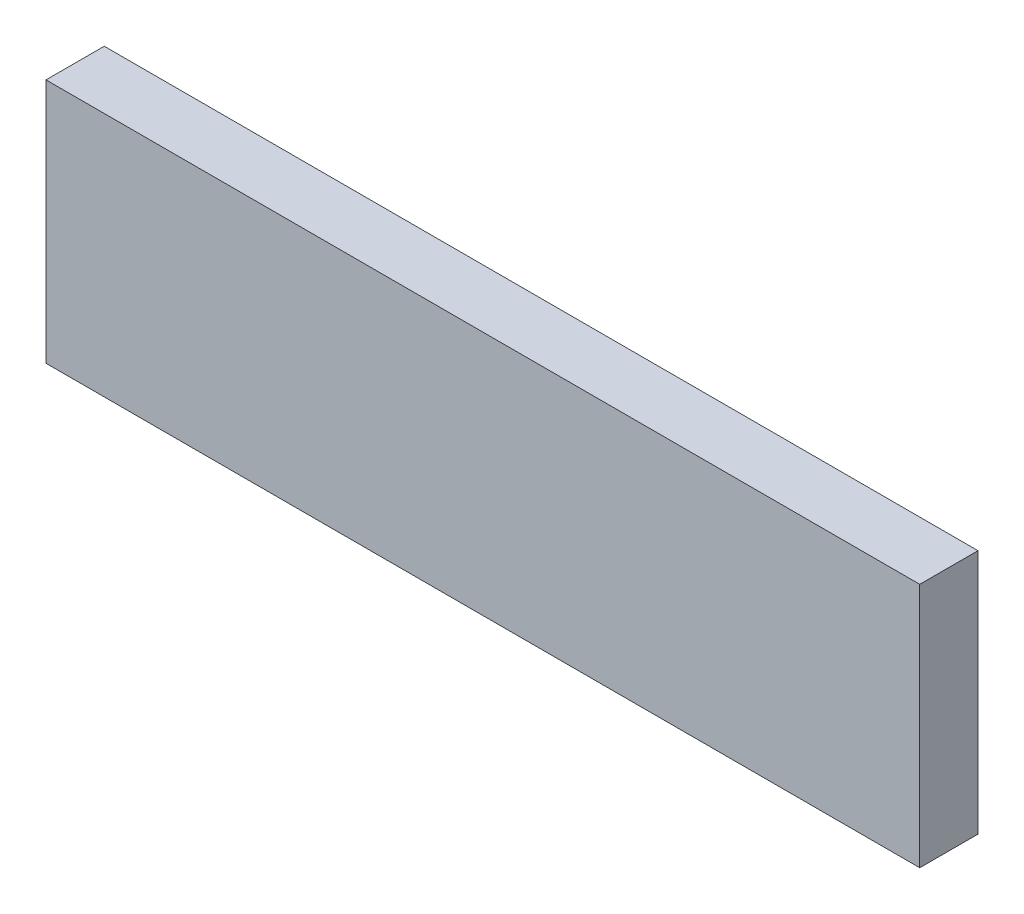
ISO-10303-21;
HEADER;
FILE_DESCRIPTION(('STEP AP214'),'2;1');
FILE_NAME('part.step','',(''),(''),'','','');
FILE_SCHEMA(('AUTOMOTIVE_DESIGN { 1 0 10303 214 1 1 1 1 }'));
ENDSEC;
DATA;
#1=APPLICATION_CONTEXT('core data for automotive mechanical design processes');
#2=APPLICATION_PROTOCOL_DEFINITION('international standard','automotive_design',2000,#1);
#3=PRODUCT_CONTEXT('',#1,'mechanical');
#4=PRODUCT('Part','Part','',(#3));
#5=PRODUCT_RELATED_PRODUCT_CATEGORY('part','',(#4));
#6=PRODUCT_DEFINITION_FORMATION('','',#4);
#7=PRODUCT_DEFINITION_CONTEXT('part definition',#1,'design');
#8=PRODUCT_DEFINITION('design','',#6,#7);
#9=PRODUCT_DEFINITION_SHAPE('','',#8);
#10=(LENGTH_UNIT() NAMED_UNIT(*) SI_UNIT(.MILLI.,.METRE.));
#11=(NAMED_UNIT(*) PLANE_ANGLE_UNIT() SI_UNIT($,.RADIAN.));
#12=(NAMED_UNIT(*) SI_UNIT($,.STERADIAN.) SOLID_ANGLE_UNIT());
#13=UNCERTAINTY_MEASURE_WITH_UNIT(LENGTH_MEASURE(1.E-05),#10,'distance_accuracy_value','');
#14=(GEOMETRIC_REPRESENTATION_CONTEXT(3) GLOBAL_UNCERTAINTY_ASSIGNED_CONTEXT((#13)) GLOBAL_UNIT_ASSIGNED_CONTEXT((#10,
#11,#12)) REPRESENTATION_CONTEXT('',''));
#15=CARTESIAN_POINT('',(0.,0.,0.));
#16=DIRECTION('',(0.,0.,1.));
#17=DIRECTION('',(1.,0.,0.));
#18=AXIS2_PLACEMENT_3D('',#15,#16,#17);
#19=CARTESIAN_POINT('',(0.,0.,7.));
#20=DIRECTION('',(1.,0.,0.));
#21=DIRECTION('',(0.,0.,-1.));
#22=AXIS2_PLACEMENT_3D('',#19,#20,#21);
#23=PLANE('',#22);
#24=DIRECTION('',(0.,-1.,0.));
#25=VECTOR('',#24,1.);
#26=CARTESIAN_POINT('',(0.,0.,0.));
#27=LINE('',#26,#25);
#28=CARTESIAN_POINT('',(0.,0.,0.));
#29=VERTEX_POINT('',#28);
#30=CARTESIAN_POINT('',(0.,-29.5,0.));
#31=VERTEX_POINT('',#30);
#32=EDGE_CURVE('E109',#29,#31,#27,.T.);
#33=ORIENTED_EDGE('',*,*,#32,.T.);
#34=DIRECTION('',(0.,0.,-1.));
#35=VECTOR('',#34,1.);
#36=CARTESIAN_POINT('',(0.,-29.5,7.));
#37=LINE('',#36,#35);
#38=CARTESIAN_POINT('',(0.,-29.5,7.));
#39=VERTEX_POINT('',#38);
#40=EDGE_CURVE('E11',#39,#31,#37,.T.);
#41=ORIENTED_EDGE('',*,*,#40,.F.);
#42=DIRECTION('',(0.,-1.,0.));
#43=VECTOR('',#42,1.);
#44=CARTESIAN_POINT('',(0.,0.,7.));
#45=LINE('',#44,#43);
#46=CARTESIAN_POINT('',(0.,0.,7.));
#47=VERTEX_POINT('',#46);
#48=EDGE_CURVE('E93',#47,#39,#45,.T.);
#49=ORIENTED_EDGE('',*,*,#48,.F.);
#50=DIRECTION('',(0.,0.,-1.));
#51=VECTOR('',#50,1.);
#52=CARTESIAN_POINT('',(0.,0.,7.));
#53=LINE('',#52,#51);
#54=EDGE_CURVE('E105',#47,#29,#53,.T.);
#55=ORIENTED_EDGE('',*,*,#54,.T.);
#56=EDGE_LOOP('',(#33,#41,#49,#55));
#57=FACE_BOUND('',#56,.T.);
#58=ADVANCED_FACE('F41',(#57),#23,.F.);
#59=CARTESIAN_POINT('',(0.,-29.5,7.));
#60=DIRECTION('',(0.,1.,0.));
#61=DIRECTION('',(0.,0.,1.));
#62=AXIS2_PLACEMENT_3D('',#59,#60,#61);
#63=PLANE('',#62);
#64=DIRECTION('',(1.,0.,0.));
#65=VECTOR('',#64,1.);
#66=CARTESIAN_POINT('',(0.,-29.5,0.));
#67=LINE('',#66,#65);
#68=CARTESIAN_POINT('',(105.,-29.5,0.));
#69=VERTEX_POINT('',#68);
#70=EDGE_CURVE('E98',#31,#69,#67,.T.);
#71=ORIENTED_EDGE('',*,*,#70,.T.);
#72=DIRECTION('',(0.,0.,-1.));
#73=VECTOR('',#72,1.);
#74=CARTESIAN_POINT('',(105.,-29.5,7.));
#75=LINE('',#74,#73);
#76=CARTESIAN_POINT('',(105.,-29.5,7.));
#77=VERTEX_POINT('',#76);
#78=EDGE_CURVE('E50',#77,#69,#75,.T.);
#79=ORIENTED_EDGE('',*,*,#78,.F.);
#80=DIRECTION('',(1.,0.,0.));
#81=VECTOR('',#80,1.);
#82=CARTESIAN_POINT('',(0.,-29.5,7.));
#83=LINE('',#82,#81);
#84=EDGE_CURVE('E88',#39,#77,#83,.T.);
#85=ORIENTED_EDGE('',*,*,#84,.F.);
#86=ORIENTED_EDGE('',*,*,#40,.T.);
#87=EDGE_LOOP('',(#71,#79,#85,#86));
#88=FACE_BOUND('',#87,.T.);
#89=ADVANCED_FACE('F97',(#88),#63,.F.);
#90=CARTESIAN_POINT('',(105.,0.,7.));
#91=DIRECTION('',(-1.,0.,0.));
#92=DIRECTION('',(0.,0.,1.));
#93=AXIS2_PLACEMENT_3D('',#90,#91,#92);
#94=PLANE('',#93);
#95=DIRECTION('',(0.,1.,0.));
#96=VECTOR('',#95,1.);
#97=CARTESIAN_POINT('',(105.,0.,0.));
#98=LINE('',#97,#96);
#99=CARTESIAN_POINT('',(105.,0.,0.));
#100=VERTEX_POINT('',#99);
#101=EDGE_CURVE('E75',#69,#100,#98,.T.);
#102=ORIENTED_EDGE('',*,*,#101,.T.);
#103=DIRECTION('',(0.,0.,-1.));
#104=VECTOR('',#103,1.);
#105=CARTESIAN_POINT('',(105.,0.,7.));
#106=LINE('',#105,#104);
#107=CARTESIAN_POINT('',(105.,0.,7.));
#108=VERTEX_POINT('',#107);
#109=EDGE_CURVE('E100',#108,#100,#106,.T.);
#110=ORIENTED_EDGE('',*,*,#109,.F.);
#111=DIRECTION('',(0.,1.,0.));
#112=VECTOR('',#111,1.);
#113=CARTESIAN_POINT('',(105.,0.,7.));
#114=LINE('',#113,#112);
#115=EDGE_CURVE('E91',#77,#108,#114,.T.);
#116=ORIENTED_EDGE('',*,*,#115,.F.);
#117=ORIENTED_EDGE('',*,*,#78,.T.);
#118=EDGE_LOOP('',(#102,#110,#116,#117));
#119=FACE_BOUND('',#118,.T.);
#120=ADVANCED_FACE('F101',(#119),#94,.F.);
#121=CARTESIAN_POINT('',(0.,0.,7.));
#122=DIRECTION('',(0.,-1.,0.));
#123=DIRECTION('',(0.,0.,-1.));
#124=AXIS2_PLACEMENT_3D('',#121,#122,#123);
#125=PLANE('',#124);
#126=DIRECTION('',(-1.,0.,0.));
#127=VECTOR('',#126,1.);
#128=CARTESIAN_POINT('',(0.,0.,0.));
#129=LINE('',#128,#127);
#130=EDGE_CURVE('E81',#100,#29,#129,.T.);
#131=ORIENTED_EDGE('',*,*,#130,.T.);
#132=ORIENTED_EDGE('',*,*,#54,.F.);
#133=DIRECTION('',(-1.,0.,0.));
#134=VECTOR('',#133,1.);
#135=CARTESIAN_POINT('',(0.,0.,7.));
#136=LINE('',#135,#134);
#137=EDGE_CURVE('E58',#108,#47,#136,.T.);
#138=ORIENTED_EDGE('',*,*,#137,.F.);
#139=ORIENTED_EDGE('',*,*,#109,.T.);
#140=EDGE_LOOP('',(#131,#132,#138,#139));
#141=FACE_BOUND('',#140,.T.);
#142=ADVANCED_FACE('F122',(#141),#125,.F.);
#143=CARTESIAN_POINT('',(0.,0.,7.));
#144=DIRECTION('',(0.,0.,1.));
#145=DIRECTION('',(1.,0.,0.));
#146=AXIS2_PLACEMENT_3D('',#143,#144,#145);
#147=PLANE('',#146);
#148=ORIENTED_EDGE('',*,*,#48,.T.);
#149=ORIENTED_EDGE('',*,*,#84,.T.);
#150=ORIENTED_EDGE('',*,*,#115,.T.);
#151=ORIENTED_EDGE('',*,*,#137,.T.);
#152=EDGE_LOOP('',(#148,#149,#150,#151));
#153=FACE_BOUND('',#152,.T.);
#154=ADVANCED_FACE('F89',(#153),#147,.T.);
#155=CARTESIAN_POINT('',(0.,0.,0.));
#156=DIRECTION('',(0.,0.,1.));
#157=DIRECTION('',(1.,0.,0.));
#158=AXIS2_PLACEMENT_3D('',#155,#156,#157);
#159=PLANE('',#158);
#160=ORIENTED_EDGE('',*,*,#32,.F.);
#161=ORIENTED_EDGE('',*,*,#130,.F.);
#162=ORIENTED_EDGE('',*,*,#101,.F.);
#163=ORIENTED_EDGE('',*,*,#70,.F.);
#164=EDGE_LOOP('',(#160,#161,#162,#163));
#165=FACE_BOUND('',#164,.T.);
#166=ADVANCED_FACE('F125',(#165),#159,.F.);
#167=CLOSED_SHELL('',(#58,#89,#120,#142,#154,#166));
#168=MANIFOLD_SOLID_BREP('B2',#167);
#169=ADVANCED_BREP_SHAPE_REPRESENTATION('',(#18,#168),#14);
#170=SHAPE_DEFINITION_REPRESENTATION(#9,#169);
ENDSEC;
END-ISO-10303-21;
